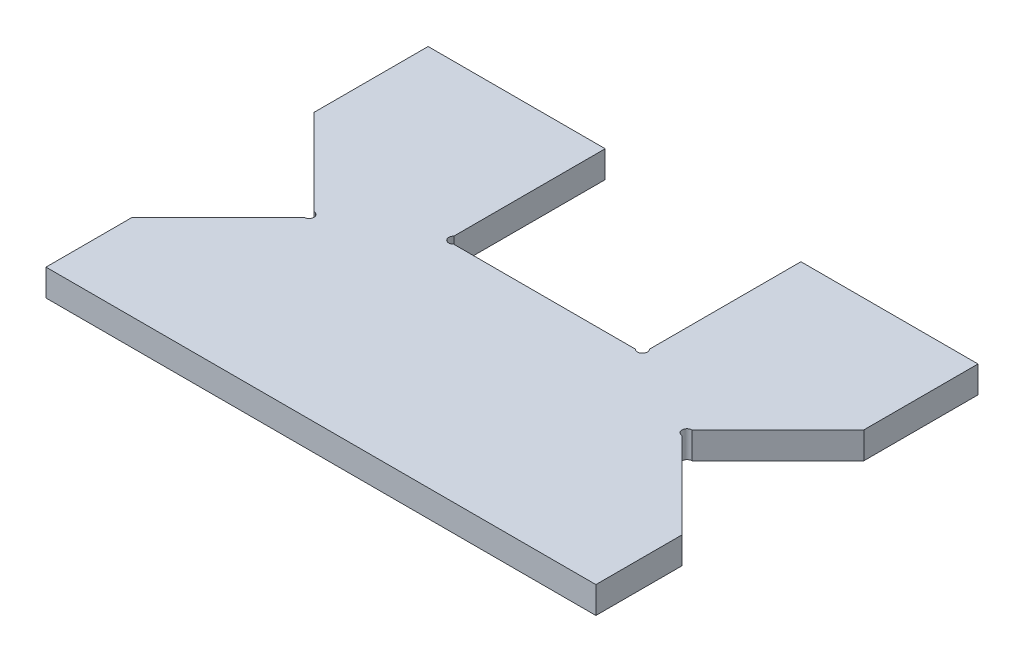
ISO-10303-21;
HEADER;
FILE_DESCRIPTION(('STEP AP214'),'2;1');
FILE_NAME('part.step','',(''),(''),'','','');
FILE_SCHEMA(('AUTOMOTIVE_DESIGN { 1 0 10303 214 1 1 1 1 }'));
ENDSEC;
DATA;
#1=APPLICATION_CONTEXT('core data for automotive mechanical design processes');
#2=APPLICATION_PROTOCOL_DEFINITION('international standard','automotive_design',2000,#1);
#3=PRODUCT_CONTEXT('',#1,'mechanical');
#4=PRODUCT('Part','Part','',(#3));
#5=PRODUCT_RELATED_PRODUCT_CATEGORY('part','',(#4));
#6=PRODUCT_DEFINITION_FORMATION('','',#4);
#7=PRODUCT_DEFINITION_CONTEXT('part definition',#1,'design');
#8=PRODUCT_DEFINITION('design','',#6,#7);
#9=PRODUCT_DEFINITION_SHAPE('','',#8);
#10=(LENGTH_UNIT() NAMED_UNIT(*) SI_UNIT(.MILLI.,.METRE.));
#11=(NAMED_UNIT(*) PLANE_ANGLE_UNIT() SI_UNIT($,.RADIAN.));
#12=(NAMED_UNIT(*) SI_UNIT($,.STERADIAN.) SOLID_ANGLE_UNIT());
#13=UNCERTAINTY_MEASURE_WITH_UNIT(LENGTH_MEASURE(1.E-05),#10,'distance_accuracy_value','');
#14=(GEOMETRIC_REPRESENTATION_CONTEXT(3) GLOBAL_UNCERTAINTY_ASSIGNED_CONTEXT((#13)) GLOBAL_UNIT_ASSIGNED_CONTEXT((#10,
#11,#12)) REPRESENTATION_CONTEXT('',''));
#15=CARTESIAN_POINT('',(0.,0.,0.));
#16=DIRECTION('',(0.,0.,1.));
#17=DIRECTION('',(1.,0.,0.));
#18=AXIS2_PLACEMENT_3D('',#15,#16,#17);
#19=CARTESIAN_POINT('',(-187.325,18.25625,558.8));
#20=DIRECTION('',(1.,0.,0.));
#21=DIRECTION('',(0.,0.,-1.));
#22=AXIS2_PLACEMENT_3D('',#19,#20,#21);
#23=PLANE('',#22);
#24=DIRECTION('',(0.,0.,1.));
#25=VECTOR('',#24,1.);
#26=CARTESIAN_POINT('',(-187.325,0.,558.8));
#27=LINE('',#26,#25);
#28=CARTESIAN_POINT('',(-187.325,0.,0.));
#29=VERTEX_POINT('',#28);
#30=CARTESIAN_POINT('',(-187.325,0.,77.7875));
#31=VERTEX_POINT('',#30);
#32=EDGE_CURVE('E198',#29,#31,#27,.T.);
#33=ORIENTED_EDGE('',*,*,#32,.T.);
#34=DIRECTION('',(0.,1.,0.));
#35=VECTOR('',#34,1.);
#36=CARTESIAN_POINT('',(-187.325,0.,77.7875));
#37=LINE('',#36,#35);
#38=CARTESIAN_POINT('',(-187.325,18.25625,77.7875));
#39=VERTEX_POINT('',#38);
#40=EDGE_CURVE('E270',#31,#39,#37,.T.);
#41=ORIENTED_EDGE('',*,*,#40,.T.);
#42=DIRECTION('',(0.,0.,1.));
#43=VECTOR('',#42,1.);
#44=CARTESIAN_POINT('',(-187.325,18.25625,558.8));
#45=LINE('',#44,#43);
#46=CARTESIAN_POINT('',(-187.325,18.25625,0.));
#47=VERTEX_POINT('',#46);
#48=EDGE_CURVE('E290',#47,#39,#45,.T.);
#49=ORIENTED_EDGE('',*,*,#48,.F.);
#50=DIRECTION('',(0.,-1.,0.));
#51=VECTOR('',#50,1.);
#52=CARTESIAN_POINT('',(-187.325,18.25625,0.));
#53=LINE('',#52,#51);
#54=EDGE_CURVE('E220',#47,#29,#53,.T.);
#55=ORIENTED_EDGE('',*,*,#54,.T.);
#56=EDGE_LOOP('',(#33,#41,#49,#55));
#57=FACE_BOUND('',#56,.T.);
#58=ADVANCED_FACE('F46',(#57),#23,.F.);
#59=CARTESIAN_POINT('',(187.325,18.25625,558.8));
#60=DIRECTION('',(-1.,0.,0.));
#61=DIRECTION('',(0.,0.,1.));
#62=AXIS2_PLACEMENT_3D('',#59,#60,#61);
#63=PLANE('',#62);
#64=DIRECTION('',(0.,0.,-1.));
#65=VECTOR('',#64,1.);
#66=CARTESIAN_POINT('',(187.325,18.25625,558.8));
#67=LINE('',#66,#65);
#68=CARTESIAN_POINT('',(187.325,18.25625,77.7875));
#69=VERTEX_POINT('',#68);
#70=CARTESIAN_POINT('',(187.325,18.25625,0.));
#71=VERTEX_POINT('',#70);
#72=EDGE_CURVE('E293',#69,#71,#67,.T.);
#73=ORIENTED_EDGE('',*,*,#72,.F.);
#74=DIRECTION('',(0.,1.,0.));
#75=VECTOR('',#74,1.);
#76=CARTESIAN_POINT('',(187.325,0.,77.7875));
#77=LINE('',#76,#75);
#78=CARTESIAN_POINT('',(187.325,0.,77.7875));
#79=VERTEX_POINT('',#78);
#80=EDGE_CURVE('E268',#79,#69,#77,.T.);
#81=ORIENTED_EDGE('',*,*,#80,.F.);
#82=DIRECTION('',(0.,0.,-1.));
#83=VECTOR('',#82,1.);
#84=CARTESIAN_POINT('',(187.325,0.,558.8));
#85=LINE('',#84,#83);
#86=CARTESIAN_POINT('',(187.325,0.,0.));
#87=VERTEX_POINT('',#86);
#88=EDGE_CURVE('E194',#79,#87,#85,.T.);
#89=ORIENTED_EDGE('',*,*,#88,.T.);
#90=DIRECTION('',(0.,-1.,0.));
#91=VECTOR('',#90,1.);
#92=CARTESIAN_POINT('',(187.325,18.25625,0.));
#93=LINE('',#92,#91);
#94=EDGE_CURVE('E217',#71,#87,#93,.T.);
#95=ORIENTED_EDGE('',*,*,#94,.F.);
#96=EDGE_LOOP('',(#73,#81,#89,#95));
#97=FACE_BOUND('',#96,.T.);
#98=ADVANCED_FACE('F325',(#97),#63,.F.);
#99=CARTESIAN_POINT('',(-187.325,18.25625,0.));
#100=DIRECTION('',(0.,0.,1.));
#101=DIRECTION('',(1.,0.,0.));
#102=AXIS2_PLACEMENT_3D('',#99,#100,#101);
#103=PLANE('',#102);
#104=DIRECTION('',(-1.,0.,0.));
#105=VECTOR('',#104,1.);
#106=CARTESIAN_POINT('',(-187.325,0.,0.));
#107=LINE('',#106,#105);
#108=CARTESIAN_POINT('',(-66.675,0.,0.));
#109=VERTEX_POINT('',#108);
#110=EDGE_CURVE('E273',#109,#29,#107,.T.);
#111=ORIENTED_EDGE('',*,*,#110,.T.);
#112=ORIENTED_EDGE('',*,*,#54,.F.);
#113=DIRECTION('',(-1.,0.,0.));
#114=VECTOR('',#113,1.);
#115=CARTESIAN_POINT('',(-187.325,18.25625,0.));
#116=LINE('',#115,#114);
#117=CARTESIAN_POINT('',(-66.675,18.25625,0.));
#118=VERTEX_POINT('',#117);
#119=EDGE_CURVE('E209',#118,#47,#116,.T.);
#120=ORIENTED_EDGE('',*,*,#119,.F.);
#121=DIRECTION('',(0.,-1.,0.));
#122=VECTOR('',#121,1.);
#123=CARTESIAN_POINT('',(-66.675,18.25625,0.));
#124=LINE('',#123,#122);
#125=EDGE_CURVE('E210',#118,#109,#124,.T.);
#126=ORIENTED_EDGE('',*,*,#125,.T.);
#127=EDGE_LOOP('',(#111,#112,#120,#126));
#128=FACE_BOUND('',#127,.T.);
#129=ADVANCED_FACE('F48',(#128),#103,.F.);
#130=CARTESIAN_POINT('',(-187.325,0.,201.612500000001));
#131=VERTEX_POINT('',#130);
#132=CARTESIAN_POINT('',(-187.325,0.,260.35));
#133=VERTEX_POINT('',#132);
#134=EDGE_CURVE('E304',#131,#133,#27,.T.);
#135=ORIENTED_EDGE('',*,*,#134,.T.);
#136=DIRECTION('',(0.,1.,0.));
#137=VECTOR('',#136,1.);
#138=CARTESIAN_POINT('',(-187.325,0.,260.35));
#139=LINE('',#138,#137);
#140=CARTESIAN_POINT('',(-187.325,18.25625,260.35));
#141=VERTEX_POINT('',#140);
#142=EDGE_CURVE('E63',#133,#141,#139,.T.);
#143=ORIENTED_EDGE('',*,*,#142,.T.);
#144=CARTESIAN_POINT('',(-187.325,18.25625,201.612500000001));
#145=VERTEX_POINT('',#144);
#146=EDGE_CURVE('E289',#145,#141,#45,.T.);
#147=ORIENTED_EDGE('',*,*,#146,.F.);
#148=DIRECTION('',(0.,1.,0.));
#149=VECTOR('',#148,1.);
#150=CARTESIAN_POINT('',(-187.325,0.,201.612500000001));
#151=LINE('',#150,#149);
#152=EDGE_CURVE('E264',#131,#145,#151,.T.);
#153=ORIENTED_EDGE('',*,*,#152,.F.);
#154=EDGE_LOOP('',(#135,#143,#147,#153));
#155=FACE_BOUND('',#154,.T.);
#156=ADVANCED_FACE('F324',(#155),#23,.F.);
#157=CARTESIAN_POINT('',(187.325,18.25625,260.35));
#158=VERTEX_POINT('',#157);
#159=CARTESIAN_POINT('',(187.325,18.25625,201.612500000001));
#160=VERTEX_POINT('',#159);
#161=EDGE_CURVE('E186',#158,#160,#67,.T.);
#162=ORIENTED_EDGE('',*,*,#161,.F.);
#163=DIRECTION('',(0.,1.,0.));
#164=VECTOR('',#163,1.);
#165=CARTESIAN_POINT('',(187.325,0.,260.35));
#166=LINE('',#165,#164);
#167=CARTESIAN_POINT('',(187.325,0.,260.35));
#168=VERTEX_POINT('',#167);
#169=EDGE_CURVE('E172',#168,#158,#166,.T.);
#170=ORIENTED_EDGE('',*,*,#169,.F.);
#171=CARTESIAN_POINT('',(187.325,0.,201.612500000001));
#172=VERTEX_POINT('',#171);
#173=EDGE_CURVE('E184',#168,#172,#85,.T.);
#174=ORIENTED_EDGE('',*,*,#173,.T.);
#175=DIRECTION('',(0.,1.,0.));
#176=VECTOR('',#175,1.);
#177=CARTESIAN_POINT('',(187.325,0.,201.612500000001));
#178=LINE('',#177,#176);
#179=EDGE_CURVE('E280',#172,#160,#178,.T.);
#180=ORIENTED_EDGE('',*,*,#179,.T.);
#181=EDGE_LOOP('',(#162,#170,#174,#180));
#182=FACE_BOUND('',#181,.T.);
#183=ADVANCED_FACE('F182',(#182),#63,.F.);
#184=CARTESIAN_POINT('',(187.325,18.25625,0.));
#185=DIRECTION('',(0.,0.,1.));
#186=DIRECTION('',(1.,0.,0.));
#187=AXIS2_PLACEMENT_3D('',#184,#185,#186);
#188=PLANE('',#187);
#189=DIRECTION('',(-1.,0.,0.));
#190=VECTOR('',#189,1.);
#191=CARTESIAN_POINT('',(187.325,0.,0.));
#192=LINE('',#191,#190);
#193=CARTESIAN_POINT('',(66.675,0.,0.));
#194=VERTEX_POINT('',#193);
#195=EDGE_CURVE('E193',#87,#194,#192,.T.);
#196=ORIENTED_EDGE('',*,*,#195,.T.);
#197=DIRECTION('',(0.,-1.,0.));
#198=VECTOR('',#197,1.);
#199=CARTESIAN_POINT('',(66.675,18.25625,0.));
#200=LINE('',#199,#198);
#201=CARTESIAN_POINT('',(66.675,18.25625,0.));
#202=VERTEX_POINT('',#201);
#203=EDGE_CURVE('E213',#202,#194,#200,.T.);
#204=ORIENTED_EDGE('',*,*,#203,.F.);
#205=DIRECTION('',(-1.,0.,0.));
#206=VECTOR('',#205,1.);
#207=CARTESIAN_POINT('',(187.325,18.25625,0.));
#208=LINE('',#207,#206);
#209=EDGE_CURVE('E295',#71,#202,#208,.T.);
#210=ORIENTED_EDGE('',*,*,#209,.F.);
#211=ORIENTED_EDGE('',*,*,#94,.T.);
#212=EDGE_LOOP('',(#196,#204,#210,#211));
#213=FACE_BOUND('',#212,.T.);
#214=ADVANCED_FACE('F337',(#213),#188,.F.);
#215=CARTESIAN_POINT('',(66.675,18.25625,107.95));
#216=DIRECTION('',(1.,0.,0.));
#217=DIRECTION('',(0.,0.,-1.));
#218=AXIS2_PLACEMENT_3D('',#215,#216,#217);
#219=PLANE('',#218);
#220=DIRECTION('',(0.,0.,1.));
#221=VECTOR('',#220,1.);
#222=CARTESIAN_POINT('',(66.675,0.,107.95));
#223=LINE('',#222,#221);
#224=CARTESIAN_POINT('',(66.675,0.,103.172527206206));
#225=VERTEX_POINT('',#224);
#226=EDGE_CURVE('E196',#194,#225,#223,.T.);
#227=ORIENTED_EDGE('',*,*,#226,.T.);
#228=DIRECTION('',(0.,1.,0.));
#229=VECTOR('',#228,1.);
#230=CARTESIAN_POINT('',(66.675,18.25625,103.172527206206));
#231=LINE('',#230,#229);
#232=CARTESIAN_POINT('',(66.675,18.25625,103.172527206206));
#233=VERTEX_POINT('',#232);
#234=EDGE_CURVE('E50',#225,#233,#231,.T.);
#235=ORIENTED_EDGE('',*,*,#234,.T.);
#236=DIRECTION('',(0.,0.,1.));
#237=VECTOR('',#236,1.);
#238=CARTESIAN_POINT('',(66.675,18.25625,107.95));
#239=LINE('',#238,#237);
#240=EDGE_CURVE('E297',#202,#233,#239,.T.);
#241=ORIENTED_EDGE('',*,*,#240,.F.);
#242=ORIENTED_EDGE('',*,*,#203,.T.);
#243=EDGE_LOOP('',(#227,#235,#241,#242));
#244=FACE_BOUND('',#243,.T.);
#245=ADVANCED_FACE('F340',(#244),#219,.F.);
#246=CARTESIAN_POINT('',(66.675,18.25625,107.95));
#247=DIRECTION('',(0.,0.,1.));
#248=DIRECTION('',(1.,0.,0.));
#249=AXIS2_PLACEMENT_3D('',#246,#247,#248);
#250=PLANE('',#249);
#251=DIRECTION('',(-1.,0.,0.));
#252=VECTOR('',#251,1.);
#253=CARTESIAN_POINT('',(66.675,0.,107.95));
#254=LINE('',#253,#252);
#255=CARTESIAN_POINT('',(61.8975272062056,0.,107.95));
#256=VERTEX_POINT('',#255);
#257=CARTESIAN_POINT('',(-61.8975272062056,0.,107.95));
#258=VERTEX_POINT('',#257);
#259=EDGE_CURVE('E204',#256,#258,#254,.T.);
#260=ORIENTED_EDGE('',*,*,#259,.T.);
#261=DIRECTION('',(0.,1.,0.));
#262=VECTOR('',#261,1.);
#263=CARTESIAN_POINT('',(-61.8975272062056,18.25625,107.95));
#264=LINE('',#263,#262);
#265=CARTESIAN_POINT('',(-61.8975272062056,18.25625,107.95));
#266=VERTEX_POINT('',#265);
#267=EDGE_CURVE('E70',#258,#266,#264,.T.);
#268=ORIENTED_EDGE('',*,*,#267,.T.);
#269=DIRECTION('',(-1.,0.,0.));
#270=VECTOR('',#269,1.);
#271=CARTESIAN_POINT('',(66.675,18.25625,107.95));
#272=LINE('',#271,#270);
#273=CARTESIAN_POINT('',(61.8975272062056,18.25625,107.95));
#274=VERTEX_POINT('',#273);
#275=EDGE_CURVE('E300',#274,#266,#272,.T.);
#276=ORIENTED_EDGE('',*,*,#275,.F.);
#277=DIRECTION('',(0.,1.,0.));
#278=VECTOR('',#277,1.);
#279=CARTESIAN_POINT('',(61.8975272062056,18.25625,107.95));
#280=LINE('',#279,#278);
#281=EDGE_CURVE('E242',#274,#256,#280,.F.);
#282=ORIENTED_EDGE('',*,*,#281,.T.);
#283=EDGE_LOOP('',(#260,#268,#276,#282));
#284=FACE_BOUND('',#283,.T.);
#285=ADVANCED_FACE('F344',(#284),#250,.F.);
#286=CARTESIAN_POINT('',(-66.675,18.25625,107.95));
#287=DIRECTION('',(-1.,0.,0.));
#288=DIRECTION('',(0.,0.,1.));
#289=AXIS2_PLACEMENT_3D('',#286,#287,#288);
#290=PLANE('',#289);
#291=DIRECTION('',(0.,0.,-1.));
#292=VECTOR('',#291,1.);
#293=CARTESIAN_POINT('',(-66.675,18.25625,107.95));
#294=LINE('',#293,#292);
#295=CARTESIAN_POINT('',(-66.675,18.25625,103.172527206206));
#296=VERTEX_POINT('',#295);
#297=EDGE_CURVE('E214',#296,#118,#294,.T.);
#298=ORIENTED_EDGE('',*,*,#297,.F.);
#299=DIRECTION('',(0.,1.,0.));
#300=VECTOR('',#299,1.);
#301=CARTESIAN_POINT('',(-66.675,18.25625,103.172527206206));
#302=LINE('',#301,#300);
#303=CARTESIAN_POINT('',(-66.675,0.,103.172527206206));
#304=VERTEX_POINT('',#303);
#305=EDGE_CURVE('E504',#296,#304,#302,.F.);
#306=ORIENTED_EDGE('',*,*,#305,.T.);
#307=DIRECTION('',(0.,0.,-1.));
#308=VECTOR('',#307,1.);
#309=CARTESIAN_POINT('',(-66.675,0.,107.95));
#310=LINE('',#309,#308);
#311=EDGE_CURVE('E207',#304,#109,#310,.T.);
#312=ORIENTED_EDGE('',*,*,#311,.T.);
#313=ORIENTED_EDGE('',*,*,#125,.F.);
#314=EDGE_LOOP('',(#298,#306,#312,#313));
#315=FACE_BOUND('',#314,.T.);
#316=ADVANCED_FACE('F348',(#315),#290,.F.);
#317=CARTESIAN_POINT('',(0.,18.25625,0.));
#318=DIRECTION('',(0.,1.,0.));
#319=DIRECTION('',(0.,0.,1.));
#320=AXIS2_PLACEMENT_3D('',#317,#318,#319);
#321=PLANE('',#320);
#322=DIRECTION('',(-1.,0.,0.));
#323=VECTOR('',#322,1.);
#324=CARTESIAN_POINT('',(-187.325,18.25625,260.35));
#325=LINE('',#324,#323);
#326=EDGE_CURVE('E178',#158,#141,#325,.T.);
#327=ORIENTED_EDGE('',*,*,#326,.F.);
#328=ORIENTED_EDGE('',*,*,#161,.T.);
#329=DIRECTION('',(0.707106781186544,0.,0.707106781186551));
#330=VECTOR('',#329,1.);
#331=CARTESIAN_POINT('',(125.412499999999,18.25625,139.7));
#332=LINE('',#331,#330);
#333=CARTESIAN_POINT('',(128.795985386725,18.25625,143.083485386726));
#334=VERTEX_POINT('',#333);
#335=EDGE_CURVE('E278',#334,#160,#332,.T.);
#336=ORIENTED_EDGE('',*,*,#335,.F.);
#337=CARTESIAN_POINT('',(128.785398022699,18.25625,139.7053019773));
#338=DIRECTION('',(0.,1.,0.));
#339=DIRECTION('',(0.,0.,1.));
#340=AXIS2_PLACEMENT_3D('',#337,#338,#339);
#341=CIRCLE('',#340,3.3782);
#342=CARTESIAN_POINT('',(128.785398022699,18.25625,136.3271019773));
#343=VERTEX_POINT('',#342);
#344=EDGE_CURVE('E250',#343,#334,#341,.T.);
#345=ORIENTED_EDGE('',*,*,#344,.F.);
#346=DIRECTION('',(-0.707106781186552,0.,0.707106781186543));
#347=VECTOR('',#346,1.);
#348=CARTESIAN_POINT('',(125.412499999999,18.25625,139.7));
#349=LINE('',#348,#347);
#350=EDGE_CURVE('E257',#69,#343,#349,.T.);
#351=ORIENTED_EDGE('',*,*,#350,.F.);
#352=ORIENTED_EDGE('',*,*,#72,.T.);
#353=ORIENTED_EDGE('',*,*,#209,.T.);
#354=ORIENTED_EDGE('',*,*,#240,.T.);
#355=CARTESIAN_POINT('',(64.29375,18.25625,105.56875));
#356=DIRECTION('',(0.,1.,0.));
#357=DIRECTION('',(0.,0.,1.));
#358=AXIS2_PLACEMENT_3D('',#355,#356,#357);
#359=CIRCLE('',#358,3.3782);
#360=EDGE_CURVE('E235',#274,#233,#359,.T.);
#361=ORIENTED_EDGE('',*,*,#360,.F.);
#362=ORIENTED_EDGE('',*,*,#275,.T.);
#363=CARTESIAN_POINT('',(-64.29375,18.25625,105.56875));
#364=DIRECTION('',(0.,1.,0.));
#365=DIRECTION('',(0.,0.,1.));
#366=AXIS2_PLACEMENT_3D('',#363,#364,#365);
#367=CIRCLE('',#366,3.3782);
#368=EDGE_CURVE('E13',#296,#266,#367,.T.);
#369=ORIENTED_EDGE('',*,*,#368,.F.);
#370=ORIENTED_EDGE('',*,*,#297,.T.);
#371=ORIENTED_EDGE('',*,*,#119,.T.);
#372=ORIENTED_EDGE('',*,*,#48,.T.);
#373=DIRECTION('',(-0.707106781186552,0.,-0.707106781186543));
#374=VECTOR('',#373,1.);
#375=CARTESIAN_POINT('',(-125.412499999999,18.25625,139.7));
#376=LINE('',#375,#374);
#377=CARTESIAN_POINT('',(-128.785398022699,18.25625,136.3271019773));
#378=VERTEX_POINT('',#377);
#379=EDGE_CURVE('E262',#378,#39,#376,.T.);
#380=ORIENTED_EDGE('',*,*,#379,.F.);
#381=CARTESIAN_POINT('',(-128.785398022699,18.25625,139.7053019773));
#382=DIRECTION('',(0.,1.,0.));
#383=DIRECTION('',(0.,0.,1.));
#384=AXIS2_PLACEMENT_3D('',#381,#382,#383);
#385=CIRCLE('',#384,3.3782);
#386=CARTESIAN_POINT('',(-128.795985386725,18.25625,143.083485386726));
#387=VERTEX_POINT('',#386);
#388=EDGE_CURVE('E245',#387,#378,#385,.T.);
#389=ORIENTED_EDGE('',*,*,#388,.F.);
#390=DIRECTION('',(0.707106781186544,0.,-0.707106781186551));
#391=VECTOR('',#390,1.);
#392=CARTESIAN_POINT('',(-187.325,18.25625,201.612500000001));
#393=LINE('',#392,#391);
#394=EDGE_CURVE('E265',#145,#387,#393,.T.);
#395=ORIENTED_EDGE('',*,*,#394,.F.);
#396=ORIENTED_EDGE('',*,*,#146,.T.);
#397=EDGE_LOOP('',(#327,#328,#336,#345,#351,#352,#353,#354,#361,#362,#369,#370,#371,#372,#380,
#389,#395,#396));
#398=FACE_BOUND('',#397,.T.);
#399=ADVANCED_FACE('F317',(#398),#321,.T.);
#400=CARTESIAN_POINT('',(0.,0.,0.));
#401=DIRECTION('',(0.,1.,0.));
#402=DIRECTION('',(0.,0.,1.));
#403=AXIS2_PLACEMENT_3D('',#400,#401,#402);
#404=PLANE('',#403);
#405=ORIENTED_EDGE('',*,*,#173,.F.);
#406=DIRECTION('',(-1.,0.,0.));
#407=VECTOR('',#406,1.);
#408=CARTESIAN_POINT('',(-187.325,0.,260.35));
#409=LINE('',#408,#407);
#410=EDGE_CURVE('E169',#168,#133,#409,.T.);
#411=ORIENTED_EDGE('',*,*,#410,.T.);
#412=ORIENTED_EDGE('',*,*,#134,.F.);
#413=DIRECTION('',(0.707106781186544,0.,-0.707106781186551));
#414=VECTOR('',#413,1.);
#415=CARTESIAN_POINT('',(-187.325,0.,201.612500000001));
#416=LINE('',#415,#414);
#417=CARTESIAN_POINT('',(-128.795985386725,0.,143.083485386726));
#418=VERTEX_POINT('',#417);
#419=EDGE_CURVE('E258',#131,#418,#416,.T.);
#420=ORIENTED_EDGE('',*,*,#419,.T.);
#421=CARTESIAN_POINT('',(-128.785398022699,0.,139.7053019773));
#422=DIRECTION('',(0.,1.,0.));
#423=DIRECTION('',(0.,0.,1.));
#424=AXIS2_PLACEMENT_3D('',#421,#422,#423);
#425=CIRCLE('',#424,3.3782);
#426=CARTESIAN_POINT('',(-128.785398022699,0.,136.3271019773));
#427=VERTEX_POINT('',#426);
#428=EDGE_CURVE('E247',#418,#427,#425,.T.);
#429=ORIENTED_EDGE('',*,*,#428,.T.);
#430=DIRECTION('',(-0.707106781186552,0.,-0.707106781186543));
#431=VECTOR('',#430,1.);
#432=CARTESIAN_POINT('',(-125.412499999999,0.,139.7));
#433=LINE('',#432,#431);
#434=EDGE_CURVE('E261',#427,#31,#433,.T.);
#435=ORIENTED_EDGE('',*,*,#434,.T.);
#436=ORIENTED_EDGE('',*,*,#32,.F.);
#437=ORIENTED_EDGE('',*,*,#110,.F.);
#438=ORIENTED_EDGE('',*,*,#311,.F.);
#439=CARTESIAN_POINT('',(-64.29375,0.,105.56875));
#440=DIRECTION('',(0.,1.,0.));
#441=DIRECTION('',(0.,0.,1.));
#442=AXIS2_PLACEMENT_3D('',#439,#440,#441);
#443=CIRCLE('',#442,3.3782);
#444=EDGE_CURVE('E55',#304,#258,#443,.T.);
#445=ORIENTED_EDGE('',*,*,#444,.T.);
#446=ORIENTED_EDGE('',*,*,#259,.F.);
#447=CARTESIAN_POINT('',(64.29375,0.,105.56875));
#448=DIRECTION('',(0.,1.,0.));
#449=DIRECTION('',(0.,0.,1.));
#450=AXIS2_PLACEMENT_3D('',#447,#448,#449);
#451=CIRCLE('',#450,3.3782);
#452=EDGE_CURVE('E230',#256,#225,#451,.T.);
#453=ORIENTED_EDGE('',*,*,#452,.T.);
#454=ORIENTED_EDGE('',*,*,#226,.F.);
#455=ORIENTED_EDGE('',*,*,#195,.F.);
#456=ORIENTED_EDGE('',*,*,#88,.F.);
#457=DIRECTION('',(-0.707106781186552,0.,0.707106781186543));
#458=VECTOR('',#457,1.);
#459=CARTESIAN_POINT('',(125.412499999999,0.,139.7));
#460=LINE('',#459,#458);
#461=CARTESIAN_POINT('',(128.785398022699,0.,136.3271019773));
#462=VERTEX_POINT('',#461);
#463=EDGE_CURVE('E275',#79,#462,#460,.T.);
#464=ORIENTED_EDGE('',*,*,#463,.T.);
#465=CARTESIAN_POINT('',(128.785398022699,0.,139.7053019773));
#466=DIRECTION('',(0.,1.,0.));
#467=DIRECTION('',(0.,0.,1.));
#468=AXIS2_PLACEMENT_3D('',#465,#466,#467);
#469=CIRCLE('',#468,3.3782);
#470=CARTESIAN_POINT('',(128.795985386725,0.,143.083485386726));
#471=VERTEX_POINT('',#470);
#472=EDGE_CURVE('E252',#462,#471,#469,.T.);
#473=ORIENTED_EDGE('',*,*,#472,.T.);
#474=DIRECTION('',(0.707106781186544,0.,0.707106781186551));
#475=VECTOR('',#474,1.);
#476=CARTESIAN_POINT('',(125.412499999999,0.,139.7));
#477=LINE('',#476,#475);
#478=EDGE_CURVE('E191',#471,#172,#477,.T.);
#479=ORIENTED_EDGE('',*,*,#478,.T.);
#480=EDGE_LOOP('',(#405,#411,#412,#420,#429,#435,#436,#437,#438,#445,#446,#453,#454,#455,#456,
#464,#473,#479));
#481=FACE_BOUND('',#480,.T.);
#482=ADVANCED_FACE('F188',(#481),#404,.F.);
#483=CARTESIAN_POINT('',(125.412499999999,0.,139.7));
#484=DIRECTION('',(-0.707106781186543,0.,-0.707106781186552));
#485=DIRECTION('',(-0.707106781186552,0.,0.707106781186543));
#486=AXIS2_PLACEMENT_3D('',#483,#484,#485);
#487=PLANE('',#486);
#488=ORIENTED_EDGE('',*,*,#350,.T.);
#489=DIRECTION('',(0.,1.,0.));
#490=VECTOR('',#489,1.);
#491=CARTESIAN_POINT('',(128.785398022699,18.25625,136.3271019773));
#492=LINE('',#491,#490);
#493=EDGE_CURVE('E254',#343,#462,#492,.F.);
#494=ORIENTED_EDGE('',*,*,#493,.T.);
#495=ORIENTED_EDGE('',*,*,#463,.F.);
#496=ORIENTED_EDGE('',*,*,#80,.T.);
#497=EDGE_LOOP('',(#488,#494,#495,#496));
#498=FACE_BOUND('',#497,.T.);
#499=ADVANCED_FACE('F355',(#498),#487,.F.);
#500=CARTESIAN_POINT('',(125.412499999999,0.,139.7));
#501=DIRECTION('',(-0.707106781186551,0.,0.707106781186544));
#502=DIRECTION('',(0.707106781186544,0.,0.707106781186551));
#503=AXIS2_PLACEMENT_3D('',#500,#501,#502);
#504=PLANE('',#503);
#505=ORIENTED_EDGE('',*,*,#478,.F.);
#506=DIRECTION('',(0.,1.,0.));
#507=VECTOR('',#506,1.);
#508=CARTESIAN_POINT('',(128.795985386725,18.25625,143.083485386726));
#509=LINE('',#508,#507);
#510=EDGE_CURVE('E223',#471,#334,#509,.T.);
#511=ORIENTED_EDGE('',*,*,#510,.T.);
#512=ORIENTED_EDGE('',*,*,#335,.T.);
#513=ORIENTED_EDGE('',*,*,#179,.F.);
#514=EDGE_LOOP('',(#505,#511,#512,#513));
#515=FACE_BOUND('',#514,.T.);
#516=ADVANCED_FACE('F360',(#515),#504,.F.);
#517=CARTESIAN_POINT('',(-125.412499999999,0.,139.7));
#518=DIRECTION('',(0.707106781186543,0.,-0.707106781186552));
#519=DIRECTION('',(-0.707106781186552,0.,-0.707106781186543));
#520=AXIS2_PLACEMENT_3D('',#517,#518,#519);
#521=PLANE('',#520);
#522=ORIENTED_EDGE('',*,*,#434,.F.);
#523=DIRECTION('',(0.,1.,0.));
#524=VECTOR('',#523,1.);
#525=CARTESIAN_POINT('',(-128.785398022699,18.25625,136.3271019773));
#526=LINE('',#525,#524);
#527=EDGE_CURVE('E228',#427,#378,#526,.T.);
#528=ORIENTED_EDGE('',*,*,#527,.T.);
#529=ORIENTED_EDGE('',*,*,#379,.T.);
#530=ORIENTED_EDGE('',*,*,#40,.F.);
#531=EDGE_LOOP('',(#522,#528,#529,#530));
#532=FACE_BOUND('',#531,.T.);
#533=ADVANCED_FACE('F314',(#532),#521,.F.);
#534=CARTESIAN_POINT('',(-187.325,0.,201.612500000001));
#535=DIRECTION('',(0.707106781186551,0.,0.707106781186544));
#536=DIRECTION('',(0.707106781186544,0.,-0.707106781186551));
#537=AXIS2_PLACEMENT_3D('',#534,#535,#536);
#538=PLANE('',#537);
#539=ORIENTED_EDGE('',*,*,#394,.T.);
#540=DIRECTION('',(0.,1.,0.));
#541=VECTOR('',#540,1.);
#542=CARTESIAN_POINT('',(-128.795985386725,18.25625,143.083485386726));
#543=LINE('',#542,#541);
#544=EDGE_CURVE('E226',#387,#418,#543,.F.);
#545=ORIENTED_EDGE('',*,*,#544,.T.);
#546=ORIENTED_EDGE('',*,*,#419,.F.);
#547=ORIENTED_EDGE('',*,*,#152,.T.);
#548=EDGE_LOOP('',(#539,#545,#546,#547));
#549=FACE_BOUND('',#548,.T.);
#550=ADVANCED_FACE('F365',(#549),#538,.F.);
#551=CARTESIAN_POINT('',(128.785398022699,18.25625,139.7053019773));
#552=DIRECTION('',(0.,1.,0.));
#553=DIRECTION('',(0.,0.,1.));
#554=AXIS2_PLACEMENT_3D('',#551,#552,#553);
#555=CYLINDRICAL_SURFACE('',#554,3.3782);
#556=ORIENTED_EDGE('',*,*,#344,.T.);
#557=ORIENTED_EDGE('',*,*,#510,.F.);
#558=ORIENTED_EDGE('',*,*,#472,.F.);
#559=ORIENTED_EDGE('',*,*,#493,.F.);
#560=EDGE_LOOP('',(#556,#557,#558,#559));
#561=FACE_BOUND('',#560,.T.);
#562=ADVANCED_FACE('F368',(#561),#555,.F.);
#563=CARTESIAN_POINT('',(-128.785398022699,18.25625,139.7053019773));
#564=DIRECTION('',(0.,1.,0.));
#565=DIRECTION('',(0.,0.,1.));
#566=AXIS2_PLACEMENT_3D('',#563,#564,#565);
#567=CYLINDRICAL_SURFACE('',#566,3.3782);
#568=ORIENTED_EDGE('',*,*,#388,.T.);
#569=ORIENTED_EDGE('',*,*,#527,.F.);
#570=ORIENTED_EDGE('',*,*,#428,.F.);
#571=ORIENTED_EDGE('',*,*,#544,.F.);
#572=EDGE_LOOP('',(#568,#569,#570,#571));
#573=FACE_BOUND('',#572,.T.);
#574=ADVANCED_FACE('F374',(#573),#567,.F.);
#575=CARTESIAN_POINT('',(64.29375,18.25625,105.56875));
#576=DIRECTION('',(0.,1.,0.));
#577=DIRECTION('',(0.,0.,1.));
#578=AXIS2_PLACEMENT_3D('',#575,#576,#577);
#579=CYLINDRICAL_SURFACE('',#578,3.3782);
#580=ORIENTED_EDGE('',*,*,#360,.T.);
#581=ORIENTED_EDGE('',*,*,#234,.F.);
#582=ORIENTED_EDGE('',*,*,#452,.F.);
#583=ORIENTED_EDGE('',*,*,#281,.F.);
#584=EDGE_LOOP('',(#580,#581,#582,#583));
#585=FACE_BOUND('',#584,.T.);
#586=ADVANCED_FACE('F378',(#585),#579,.F.);
#587=CARTESIAN_POINT('',(-64.29375,18.25625,105.56875));
#588=DIRECTION('',(0.,1.,0.));
#589=DIRECTION('',(0.,0.,1.));
#590=AXIS2_PLACEMENT_3D('',#587,#588,#589);
#591=CYLINDRICAL_SURFACE('',#590,3.3782);
#592=ORIENTED_EDGE('',*,*,#444,.F.);
#593=ORIENTED_EDGE('',*,*,#305,.F.);
#594=ORIENTED_EDGE('',*,*,#368,.T.);
#595=ORIENTED_EDGE('',*,*,#267,.F.);
#596=EDGE_LOOP('',(#592,#593,#594,#595));
#597=FACE_BOUND('',#596,.T.);
#598=ADVANCED_FACE('F382',(#597),#591,.F.);
#599=CARTESIAN_POINT('',(-187.325,0.,260.35));
#600=DIRECTION('',(0.,0.,-1.));
#601=DIRECTION('',(-1.,0.,0.));
#602=AXIS2_PLACEMENT_3D('',#599,#600,#601);
#603=PLANE('',#602);
#604=ORIENTED_EDGE('',*,*,#326,.T.);
#605=ORIENTED_EDGE('',*,*,#142,.F.);
#606=ORIENTED_EDGE('',*,*,#410,.F.);
#607=ORIENTED_EDGE('',*,*,#169,.T.);
#608=EDGE_LOOP('',(#604,#605,#606,#607));
#609=FACE_BOUND('',#608,.T.);
#610=ADVANCED_FACE('F171',(#609),#603,.F.);
#611=CLOSED_SHELL('',(#58,#98,#129,#156,#183,#214,#245,#285,#316,#399,#482,#499,#516,#533,#550,
#562,#574,#586,#598,#610));
#612=MANIFOLD_SOLID_BREP('B2',#611);
#613=ADVANCED_BREP_SHAPE_REPRESENTATION('',(#18,#612),#14);
#614=SHAPE_DEFINITION_REPRESENTATION(#9,#613);
ENDSEC;
END-ISO-10303-21;
